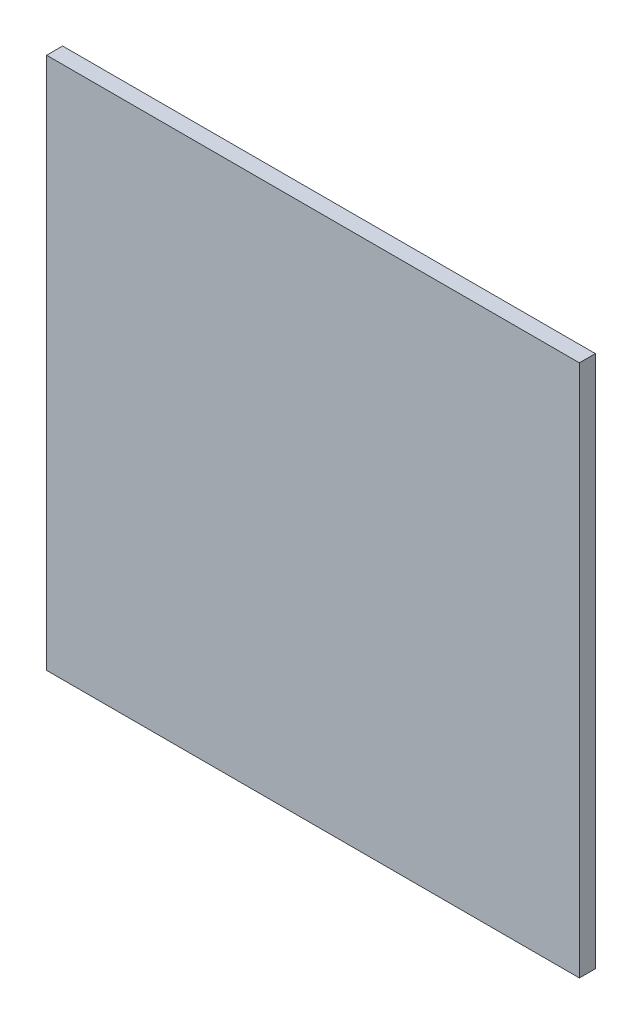
ISO-10303-21;
HEADER;
FILE_DESCRIPTION(('STEP AP214'),'2;1');
FILE_NAME('part.step','',(''),(''),'','','');
FILE_SCHEMA(('AUTOMOTIVE_DESIGN { 1 0 10303 214 1 1 1 1 }'));
ENDSEC;
DATA;
#1=APPLICATION_CONTEXT('core data for automotive mechanical design processes');
#2=APPLICATION_PROTOCOL_DEFINITION('international standard','automotive_design',2000,#1);
#3=PRODUCT_CONTEXT('',#1,'mechanical');
#4=PRODUCT('Part','Part','',(#3));
#5=PRODUCT_RELATED_PRODUCT_CATEGORY('part','',(#4));
#6=PRODUCT_DEFINITION_FORMATION('','',#4);
#7=PRODUCT_DEFINITION_CONTEXT('part definition',#1,'design');
#8=PRODUCT_DEFINITION('design','',#6,#7);
#9=PRODUCT_DEFINITION_SHAPE('','',#8);
#10=(LENGTH_UNIT() NAMED_UNIT(*) SI_UNIT(.MILLI.,.METRE.));
#11=(NAMED_UNIT(*) PLANE_ANGLE_UNIT() SI_UNIT($,.RADIAN.));
#12=(NAMED_UNIT(*) SI_UNIT($,.STERADIAN.) SOLID_ANGLE_UNIT());
#13=UNCERTAINTY_MEASURE_WITH_UNIT(LENGTH_MEASURE(1.E-05),#10,'distance_accuracy_value','');
#14=(GEOMETRIC_REPRESENTATION_CONTEXT(3) GLOBAL_UNCERTAINTY_ASSIGNED_CONTEXT((#13)) GLOBAL_UNIT_ASSIGNED_CONTEXT((#10,
#11,#12)) REPRESENTATION_CONTEXT('',''));
#15=CARTESIAN_POINT('',(0.,0.,0.));
#16=DIRECTION('',(0.,0.,1.));
#17=DIRECTION('',(1.,0.,0.));
#18=AXIS2_PLACEMENT_3D('',#15,#16,#17);
#19=CARTESIAN_POINT('',(0.,0.,0.));
#20=DIRECTION('',(0.,0.,1.));
#21=DIRECTION('',(1.,0.,0.));
#22=AXIS2_PLACEMENT_3D('',#19,#20,#21);
#23=PLANE('',#22);
#24=CARTESIAN_POINT('',(0.,0.,0.));
#25=DIRECTION('',(0.,0.,1.));
#26=DIRECTION('',(1.,0.,0.));
#27=AXIS2_PLACEMENT_3D('',#24,#25,#26);
#28=CIRCLE('',#27,50.);
#29=CARTESIAN_POINT('',(50.,0.,0.));
#30=VERTEX_POINT('',#29);
#31=EDGE_CURVE('E12',#30,#30,#28,.T.);
#32=ORIENTED_EDGE('',*,*,#31,.F.);
#33=EDGE_LOOP('',(#32));
#34=FACE_BOUND('',#33,.T.);
#35=ADVANCED_FACE('F43',(#34),#23,.F.);
#36=CARTESIAN_POINT('',(157.289403044734,194.319437241444,200.));
#37=CARTESIAN_POINT('',(42.3170970130029,26.6319976793349,0.));
#38=CARTESIAN_POINT('',(545.928277527621,-120.259368848024,200.));
#39=CARTESIAN_POINT('',(95.5810923716726,-58.0021963466709,0.));
#40=CARTESIAN_POINT('',(231.349471438153,-508.898243330911,200.));
#41=CARTESIAN_POINT('',(10.9468983456668,-111.266191705341,0.));
#42=CARTESIAN_POINT('',(-157.289403044734,-194.319437241444,200.));
#43=CARTESIAN_POINT('',(-42.3170970130029,-26.6319976793349,0.));
#44=CARTESIAN_POINT('',(-545.928277527621,120.259368848024,200.));
#45=CARTESIAN_POINT('',(-95.5810923716727,58.002196346671,0.));
#46=CARTESIAN_POINT('',(-231.349471438153,508.898243330911,200.));
#47=CARTESIAN_POINT('',(-10.9468983456668,111.266191705341,0.));
#48=CARTESIAN_POINT('',(157.289403044734,194.319437241444,200.));
#49=CARTESIAN_POINT('',(42.3170970130029,26.6319976793349,0.));
#50=(BOUNDED_SURFACE() B_SPLINE_SURFACE(3,1,((#36,#37),(#38,#39),(#40,#41),(#42,#43),(#44,#45),
(#46,#47),(#48,#49)),.UNSPECIFIED.,.T.,.F.,.F.) B_SPLINE_SURFACE_WITH_KNOTS((4,3,4),(2,2),(0.,
0.5,1.),(0.,1.),.UNSPECIFIED.) GEOMETRIC_REPRESENTATION_ITEM() RATIONAL_B_SPLINE_SURFACE(((1.,
1.),(0.333333333333333,0.333333333333334),(0.333333333333333,0.333333333333334),(1.,1.),
(0.333333333333333,0.333333333333333),(0.333333333333333,0.333333333333333),(1.,1.))) REPRESENTATION_ITEM('') SURFACE());
#51=CARTESIAN_POINT('',(0.,0.,200.));
#52=DIRECTION('',(0.,0.,1.));
#53=DIRECTION('',(1.,0.,0.));
#54=AXIS2_PLACEMENT_3D('',#51,#52,#53);
#55=CIRCLE('',#54,250.);
#56=CARTESIAN_POINT('',(250.,0.,200.));
#57=VERTEX_POINT('',#56);
#58=CARTESIAN_POINT('',(-0.00049983368950642,250.,200.));
#59=VERTEX_POINT('',#58);
#60=EDGE_CURVE('E47',#57,#59,#55,.T.);
#61=CARTESIAN_POINT('',(0.000499833689960928,-250.,200.));
#62=VERTEX_POINT('',#61);
#63=EDGE_CURVE('E60',#62,#57,#55,.T.);
#64=CARTESIAN_POINT('',(-250.,-0.000549789043169044,200.));
#65=VERTEX_POINT('',#64);
#66=EDGE_CURVE('E65',#65,#62,#55,.T.);
#67=EDGE_CURVE('E256',#59,#65,#55,.T.);
#68=ORIENTED_EDGE('',*,*,#60,.F.);
#69=ORIENTED_EDGE('',*,*,#63,.F.);
#70=ORIENTED_EDGE('',*,*,#66,.F.);
#71=ORIENTED_EDGE('',*,*,#67,.F.);
#72=EDGE_LOOP('',(#68,#69,#70,#71));
#73=FACE_BOUND('',#72,.T.);
#74=ORIENTED_EDGE('',*,*,#31,.T.);
#75=EDGE_LOOP('',(#74));
#76=FACE_BOUND('',#75,.T.);
#77=ADVANCED_FACE('F188',(#73,#76),#50,.T.);
#78=CARTESIAN_POINT('',(0.,0.,200.));
#79=DIRECTION('',(0.,0.,1.));
#80=DIRECTION('',(1.,0.,0.));
#81=AXIS2_PLACEMENT_3D('',#78,#79,#80);
#82=PLANE('',#81);
#83=DIRECTION('',(0.,1.,0.));
#84=VECTOR('',#83,1.);
#85=CARTESIAN_POINT('',(250.,-250.,200.));
#86=LINE('',#85,#84);
#87=CARTESIAN_POINT('',(250.,250.,200.));
#88=VERTEX_POINT('',#87);
#89=EDGE_CURVE('E140',#57,#88,#86,.T.);
#90=ORIENTED_EDGE('',*,*,#89,.F.);
#91=ORIENTED_EDGE('',*,*,#60,.T.);
#92=DIRECTION('',(-1.,0.,0.));
#93=VECTOR('',#92,1.);
#94=CARTESIAN_POINT('',(0.,250.,200.));
#95=LINE('',#94,#93);
#96=EDGE_CURVE('E137',#88,#59,#95,.T.);
#97=ORIENTED_EDGE('',*,*,#96,.F.);
#98=EDGE_LOOP('',(#90,#91,#97));
#99=FACE_BOUND('',#98,.T.);
#100=ADVANCED_FACE('F177',(#99),#82,.F.);
#101=CARTESIAN_POINT('',(-250.,250.,200.));
#102=VERTEX_POINT('',#101);
#103=EDGE_CURVE('E115',#59,#102,#95,.T.);
#104=ORIENTED_EDGE('',*,*,#103,.F.);
#105=ORIENTED_EDGE('',*,*,#67,.T.);
#106=DIRECTION('',(0.,-1.,0.));
#107=VECTOR('',#106,1.);
#108=CARTESIAN_POINT('',(-250.,250.,200.));
#109=LINE('',#108,#107);
#110=EDGE_CURVE('E165',#102,#65,#109,.T.);
#111=ORIENTED_EDGE('',*,*,#110,.F.);
#112=EDGE_LOOP('',(#104,#105,#111));
#113=FACE_BOUND('',#112,.T.);
#114=ADVANCED_FACE('F187',(#113),#82,.F.);
#115=CARTESIAN_POINT('',(-250.,-250.,200.));
#116=VERTEX_POINT('',#115);
#117=EDGE_CURVE('E139',#65,#116,#109,.T.);
#118=ORIENTED_EDGE('',*,*,#117,.F.);
#119=ORIENTED_EDGE('',*,*,#66,.T.);
#120=DIRECTION('',(1.,0.,0.));
#121=VECTOR('',#120,1.);
#122=CARTESIAN_POINT('',(-250.,-250.,200.));
#123=LINE('',#122,#121);
#124=EDGE_CURVE('E143',#116,#62,#123,.T.);
#125=ORIENTED_EDGE('',*,*,#124,.F.);
#126=EDGE_LOOP('',(#118,#119,#125));
#127=FACE_BOUND('',#126,.T.);
#128=ADVANCED_FACE('F160',(#127),#82,.F.);
#129=CARTESIAN_POINT('',(250.,-250.,200.));
#130=VERTEX_POINT('',#129);
#131=EDGE_CURVE('E163',#62,#130,#123,.T.);
#132=ORIENTED_EDGE('',*,*,#131,.F.);
#133=ORIENTED_EDGE('',*,*,#63,.T.);
#134=EDGE_CURVE('E108',#130,#57,#86,.T.);
#135=ORIENTED_EDGE('',*,*,#134,.F.);
#136=EDGE_LOOP('',(#132,#133,#135));
#137=FACE_BOUND('',#136,.T.);
#138=ADVANCED_FACE('F190',(#137),#82,.F.);
#139=CARTESIAN_POINT('',(0.,250.,215.));
#140=DIRECTION('',(0.,-1.,0.));
#141=DIRECTION('',(0.,0.,-1.));
#142=AXIS2_PLACEMENT_3D('',#139,#140,#141);
#143=PLANE('',#142);
#144=ORIENTED_EDGE('',*,*,#96,.T.);
#145=ORIENTED_EDGE('',*,*,#103,.T.);
#146=DIRECTION('',(0.,0.,-1.));
#147=VECTOR('',#146,1.);
#148=CARTESIAN_POINT('',(-250.,250.,215.));
#149=LINE('',#148,#147);
#150=CARTESIAN_POINT('',(-250.,250.,215.));
#151=VERTEX_POINT('',#150);
#152=EDGE_CURVE('E111',#151,#102,#149,.T.);
#153=ORIENTED_EDGE('',*,*,#152,.F.);
#154=DIRECTION('',(-1.,0.,0.));
#155=VECTOR('',#154,1.);
#156=CARTESIAN_POINT('',(250.,250.,215.));
#157=LINE('',#156,#155);
#158=CARTESIAN_POINT('',(250.,250.,215.));
#159=VERTEX_POINT('',#158);
#160=EDGE_CURVE('E97',#159,#151,#157,.T.);
#161=ORIENTED_EDGE('',*,*,#160,.F.);
#162=DIRECTION('',(0.,0.,-1.));
#163=VECTOR('',#162,1.);
#164=CARTESIAN_POINT('',(250.,250.,215.));
#165=LINE('',#164,#163);
#166=EDGE_CURVE('E129',#159,#88,#165,.T.);
#167=ORIENTED_EDGE('',*,*,#166,.T.);
#168=EDGE_LOOP('',(#144,#145,#153,#161,#167));
#169=FACE_BOUND('',#168,.T.);
#170=ADVANCED_FACE('F113',(#169),#143,.F.);
#171=CARTESIAN_POINT('',(-250.,250.,215.));
#172=DIRECTION('',(1.,0.,0.));
#173=DIRECTION('',(0.,0.,-1.));
#174=AXIS2_PLACEMENT_3D('',#171,#172,#173);
#175=PLANE('',#174);
#176=ORIENTED_EDGE('',*,*,#110,.T.);
#177=ORIENTED_EDGE('',*,*,#117,.T.);
#178=DIRECTION('',(0.,0.,-1.));
#179=VECTOR('',#178,1.);
#180=CARTESIAN_POINT('',(-250.,-250.,215.));
#181=LINE('',#180,#179);
#182=CARTESIAN_POINT('',(-250.,-250.,215.));
#183=VERTEX_POINT('',#182);
#184=EDGE_CURVE('E119',#183,#116,#181,.T.);
#185=ORIENTED_EDGE('',*,*,#184,.F.);
#186=DIRECTION('',(0.,-1.,0.));
#187=VECTOR('',#186,1.);
#188=CARTESIAN_POINT('',(-250.,250.,215.));
#189=LINE('',#188,#187);
#190=EDGE_CURVE('E101',#151,#183,#189,.T.);
#191=ORIENTED_EDGE('',*,*,#190,.F.);
#192=ORIENTED_EDGE('',*,*,#152,.T.);
#193=EDGE_LOOP('',(#176,#177,#185,#191,#192));
#194=FACE_BOUND('',#193,.T.);
#195=ADVANCED_FACE('F121',(#194),#175,.F.);
#196=CARTESIAN_POINT('',(-250.,-250.,215.));
#197=DIRECTION('',(0.,1.,0.));
#198=DIRECTION('',(0.,0.,1.));
#199=AXIS2_PLACEMENT_3D('',#196,#197,#198);
#200=PLANE('',#199);
#201=ORIENTED_EDGE('',*,*,#124,.T.);
#202=ORIENTED_EDGE('',*,*,#131,.T.);
#203=DIRECTION('',(0.,0.,-1.));
#204=VECTOR('',#203,1.);
#205=CARTESIAN_POINT('',(250.,-250.,215.));
#206=LINE('',#205,#204);
#207=CARTESIAN_POINT('',(250.,-250.,215.));
#208=VERTEX_POINT('',#207);
#209=EDGE_CURVE('E150',#208,#130,#206,.T.);
#210=ORIENTED_EDGE('',*,*,#209,.F.);
#211=DIRECTION('',(1.,0.,0.));
#212=VECTOR('',#211,1.);
#213=CARTESIAN_POINT('',(-250.,-250.,215.));
#214=LINE('',#213,#212);
#215=EDGE_CURVE('E124',#183,#208,#214,.T.);
#216=ORIENTED_EDGE('',*,*,#215,.F.);
#217=ORIENTED_EDGE('',*,*,#184,.T.);
#218=EDGE_LOOP('',(#201,#202,#210,#216,#217));
#219=FACE_BOUND('',#218,.T.);
#220=ADVANCED_FACE('F156',(#219),#200,.F.);
#221=CARTESIAN_POINT('',(250.,-250.,215.));
#222=DIRECTION('',(-1.,0.,0.));
#223=DIRECTION('',(0.,0.,1.));
#224=AXIS2_PLACEMENT_3D('',#221,#222,#223);
#225=PLANE('',#224);
#226=ORIENTED_EDGE('',*,*,#134,.T.);
#227=ORIENTED_EDGE('',*,*,#89,.T.);
#228=ORIENTED_EDGE('',*,*,#166,.F.);
#229=DIRECTION('',(0.,1.,0.));
#230=VECTOR('',#229,1.);
#231=CARTESIAN_POINT('',(250.,-250.,215.));
#232=LINE('',#231,#230);
#233=EDGE_CURVE('E104',#208,#159,#232,.T.);
#234=ORIENTED_EDGE('',*,*,#233,.F.);
#235=ORIENTED_EDGE('',*,*,#209,.T.);
#236=EDGE_LOOP('',(#226,#227,#228,#234,#235));
#237=FACE_BOUND('',#236,.T.);
#238=ADVANCED_FACE('F191',(#237),#225,.F.);
#239=CARTESIAN_POINT('',(0.,0.,215.));
#240=DIRECTION('',(0.,0.,1.));
#241=DIRECTION('',(1.,0.,0.));
#242=AXIS2_PLACEMENT_3D('',#239,#240,#241);
#243=PLANE('',#242);
#244=ORIENTED_EDGE('',*,*,#160,.T.);
#245=ORIENTED_EDGE('',*,*,#190,.T.);
#246=ORIENTED_EDGE('',*,*,#215,.T.);
#247=ORIENTED_EDGE('',*,*,#233,.T.);
#248=EDGE_LOOP('',(#244,#245,#246,#247));
#249=FACE_BOUND('',#248,.T.);
#250=ADVANCED_FACE('F99',(#249),#243,.T.);
#251=CLOSED_SHELL('',(#35,#77,#100,#114,#128,#138,#170,#195,#220,#238,#250));
#252=MANIFOLD_SOLID_BREP('B2',#251);
#253=ADVANCED_BREP_SHAPE_REPRESENTATION('',(#18,#252),#14);
#254=SHAPE_DEFINITION_REPRESENTATION(#9,#253);
ENDSEC;
END-ISO-10303-21;
